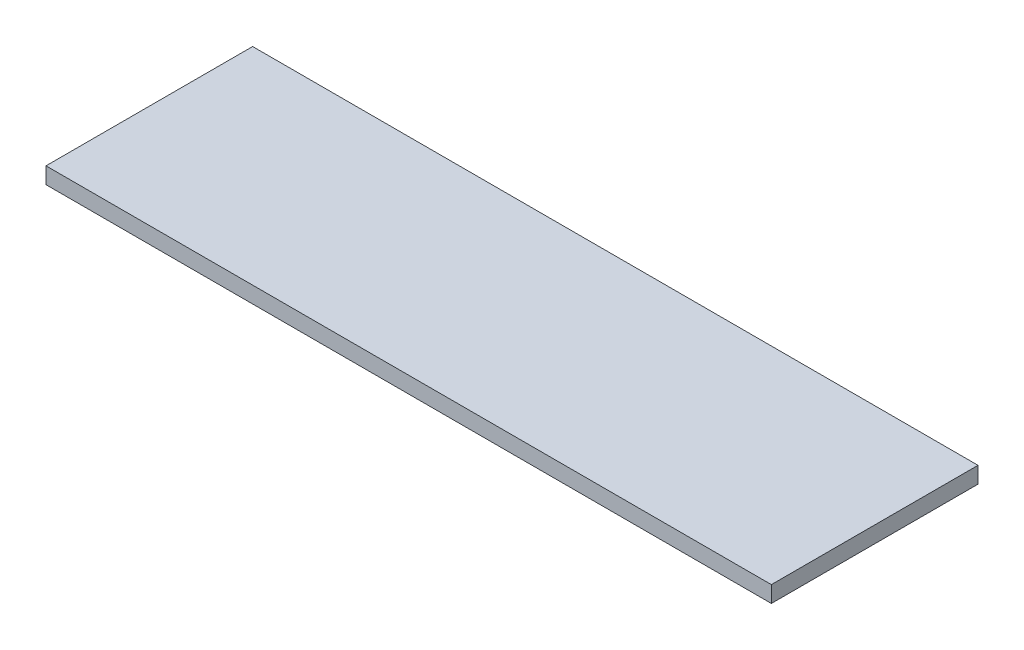
ISO-10303-21;
HEADER;
FILE_DESCRIPTION(('STEP AP214'),'2;1');
FILE_NAME('part.step','',(''),(''),'','','');
FILE_SCHEMA(('AUTOMOTIVE_DESIGN { 1 0 10303 214 1 1 1 1 }'));
ENDSEC;
DATA;
#1=APPLICATION_CONTEXT('core data for automotive mechanical design processes');
#2=APPLICATION_PROTOCOL_DEFINITION('international standard','automotive_design',2000,#1);
#3=PRODUCT_CONTEXT('',#1,'mechanical');
#4=PRODUCT('Part','Part','',(#3));
#5=PRODUCT_RELATED_PRODUCT_CATEGORY('part','',(#4));
#6=PRODUCT_DEFINITION_FORMATION('','',#4);
#7=PRODUCT_DEFINITION_CONTEXT('part definition',#1,'design');
#8=PRODUCT_DEFINITION('design','',#6,#7);
#9=PRODUCT_DEFINITION_SHAPE('','',#8);
#10=(LENGTH_UNIT() NAMED_UNIT(*) SI_UNIT(.MILLI.,.METRE.));
#11=(NAMED_UNIT(*) PLANE_ANGLE_UNIT() SI_UNIT($,.RADIAN.));
#12=(NAMED_UNIT(*) SI_UNIT($,.STERADIAN.) SOLID_ANGLE_UNIT());
#13=UNCERTAINTY_MEASURE_WITH_UNIT(LENGTH_MEASURE(1.E-05),#10,'distance_accuracy_value','');
#14=(GEOMETRIC_REPRESENTATION_CONTEXT(3) GLOBAL_UNCERTAINTY_ASSIGNED_CONTEXT((#13)) GLOBAL_UNIT_ASSIGNED_CONTEXT((#10,
#11,#12)) REPRESENTATION_CONTEXT('',''));
#15=CARTESIAN_POINT('',(0.,0.,0.));
#16=DIRECTION('',(0.,0.,1.));
#17=DIRECTION('',(1.,0.,0.));
#18=AXIS2_PLACEMENT_3D('',#15,#16,#17);
#19=CARTESIAN_POINT('',(-14.9999999999993,-17.9999999999955,-18.));
#20=DIRECTION('',(1.,0.,0.));
#21=DIRECTION('',(0.,0.,-1.));
#22=AXIS2_PLACEMENT_3D('',#19,#20,#21);
#23=PLANE('',#22);
#24=DIRECTION('',(0.,0.,1.));
#25=VECTOR('',#24,1.);
#26=CARTESIAN_POINT('',(-14.9999999999993,4.47558656802016E-12,-18.));
#27=LINE('',#26,#25);
#28=CARTESIAN_POINT('',(-14.9999999999993,4.47558656802016E-12,-18.));
#29=VERTEX_POINT('',#28);
#30=CARTESIAN_POINT('',(-14.9999999999993,4.47558656802016E-12,209.399999999997));
#31=VERTEX_POINT('',#30);
#32=EDGE_CURVE('E35',#29,#31,#27,.T.);
#33=ORIENTED_EDGE('',*,*,#32,.T.);
#34=DIRECTION('',(0.,-1.,0.));
#35=VECTOR('',#34,1.);
#36=CARTESIAN_POINT('',(-14.9999999999992,4.47651909203336E-12,209.399999999997));
#37=LINE('',#36,#35);
#38=CARTESIAN_POINT('',(-14.9999999999993,-17.9999999999955,209.399999999997));
#39=VERTEX_POINT('',#38);
#40=EDGE_CURVE('E76',#31,#39,#37,.T.);
#41=ORIENTED_EDGE('',*,*,#40,.T.);
#42=DIRECTION('',(0.,0.,1.));
#43=VECTOR('',#42,1.);
#44=CARTESIAN_POINT('',(-14.9999999999993,-17.9999999999955,-18.));
#45=LINE('',#44,#43);
#46=CARTESIAN_POINT('',(-14.9999999999993,-17.9999999999955,-18.));
#47=VERTEX_POINT('',#46);
#48=EDGE_CURVE('E11',#47,#39,#45,.T.);
#49=ORIENTED_EDGE('',*,*,#48,.F.);
#50=DIRECTION('',(0.,1.,0.));
#51=VECTOR('',#50,1.);
#52=CARTESIAN_POINT('',(-14.9999999999993,-17.9999999999955,-18.));
#53=LINE('',#52,#51);
#54=EDGE_CURVE('E90',#47,#29,#53,.T.);
#55=ORIENTED_EDGE('',*,*,#54,.T.);
#56=EDGE_LOOP('',(#33,#41,#49,#55));
#57=FACE_BOUND('',#56,.T.);
#58=ADVANCED_FACE('F32',(#57),#23,.T.);
#59=CARTESIAN_POINT('',(-14.9999999999993,-17.9999999999955,-18.));
#60=DIRECTION('',(0.,-1.,0.));
#61=DIRECTION('',(0.,0.,-1.));
#62=AXIS2_PLACEMENT_3D('',#59,#60,#61);
#63=PLANE('',#62);
#64=ORIENTED_EDGE('',*,*,#48,.T.);
#65=DIRECTION('',(-1.,0.,0.));
#66=VECTOR('',#65,1.);
#67=CARTESIAN_POINT('',(-14.9999999999993,-17.9999999999955,209.399999999997));
#68=LINE('',#67,#66);
#69=CARTESIAN_POINT('',(-813.236516537795,-17.9999999999955,209.399999999997));
#70=VERTEX_POINT('',#69);
#71=EDGE_CURVE('E72',#39,#70,#68,.T.);
#72=ORIENTED_EDGE('',*,*,#71,.T.);
#73=DIRECTION('',(0.,0.,1.));
#74=VECTOR('',#73,1.);
#75=CARTESIAN_POINT('',(-813.236516537795,-17.9999999999955,-18.));
#76=LINE('',#75,#74);
#77=CARTESIAN_POINT('',(-813.236516537795,-17.9999999999955,-18.));
#78=VERTEX_POINT('',#77);
#79=EDGE_CURVE('E40',#78,#70,#76,.T.);
#80=ORIENTED_EDGE('',*,*,#79,.F.);
#81=DIRECTION('',(1.,0.,0.));
#82=VECTOR('',#81,1.);
#83=CARTESIAN_POINT('',(-14.9999999999993,-17.9999999999955,-18.));
#84=LINE('',#83,#82);
#85=EDGE_CURVE('E74',#78,#47,#84,.T.);
#86=ORIENTED_EDGE('',*,*,#85,.T.);
#87=EDGE_LOOP('',(#64,#72,#80,#86));
#88=FACE_BOUND('',#87,.T.);
#89=ADVANCED_FACE('F70',(#88),#63,.T.);
#90=CARTESIAN_POINT('',(-813.236516537795,-17.9999999999955,-18.));
#91=DIRECTION('',(-1.,0.,0.));
#92=DIRECTION('',(0.,0.,1.));
#93=AXIS2_PLACEMENT_3D('',#90,#91,#92);
#94=PLANE('',#93);
#95=ORIENTED_EDGE('',*,*,#79,.T.);
#96=DIRECTION('',(0.,-1.,0.));
#97=VECTOR('',#96,1.);
#98=CARTESIAN_POINT('',(-813.236516537795,-17.9999999999955,209.399999999997));
#99=LINE('',#98,#97);
#100=CARTESIAN_POINT('',(-813.236516537795,4.47558656802016E-12,209.399999999997));
#101=VERTEX_POINT('',#100);
#102=EDGE_CURVE('E85',#101,#70,#99,.T.);
#103=ORIENTED_EDGE('',*,*,#102,.F.);
#104=DIRECTION('',(0.,0.,1.));
#105=VECTOR('',#104,1.);
#106=CARTESIAN_POINT('',(-813.236516537795,4.47558656802016E-12,-18.));
#107=LINE('',#106,#105);
#108=CARTESIAN_POINT('',(-813.236516537795,4.47558656802016E-12,-18.));
#109=VERTEX_POINT('',#108);
#110=EDGE_CURVE('E98',#109,#101,#107,.T.);
#111=ORIENTED_EDGE('',*,*,#110,.F.);
#112=DIRECTION('',(0.,-1.,0.));
#113=VECTOR('',#112,1.);
#114=CARTESIAN_POINT('',(-813.236516537795,-17.9999999999955,-18.));
#115=LINE('',#114,#113);
#116=EDGE_CURVE('E95',#109,#78,#115,.T.);
#117=ORIENTED_EDGE('',*,*,#116,.T.);
#118=EDGE_LOOP('',(#95,#103,#111,#117));
#119=FACE_BOUND('',#118,.T.);
#120=ADVANCED_FACE('F104',(#119),#94,.T.);
#121=CARTESIAN_POINT('',(-14.9999999999993,4.47558656802016E-12,-18.));
#122=DIRECTION('',(0.,1.,0.));
#123=DIRECTION('',(0.,0.,1.));
#124=AXIS2_PLACEMENT_3D('',#121,#122,#123);
#125=PLANE('',#124);
#126=ORIENTED_EDGE('',*,*,#110,.T.);
#127=DIRECTION('',(-1.,0.,0.));
#128=VECTOR('',#127,1.);
#129=CARTESIAN_POINT('',(-14.9999999999992,4.47651909203336E-12,209.399999999997));
#130=LINE('',#129,#128);
#131=EDGE_CURVE('E80',#31,#101,#130,.T.);
#132=ORIENTED_EDGE('',*,*,#131,.F.);
#133=ORIENTED_EDGE('',*,*,#32,.F.);
#134=DIRECTION('',(-1.,0.,0.));
#135=VECTOR('',#134,1.);
#136=CARTESIAN_POINT('',(-14.9999999999993,4.47558656802016E-12,-18.));
#137=LINE('',#136,#135);
#138=EDGE_CURVE('E92',#29,#109,#137,.T.);
#139=ORIENTED_EDGE('',*,*,#138,.T.);
#140=EDGE_LOOP('',(#126,#132,#133,#139));
#141=FACE_BOUND('',#140,.T.);
#142=ADVANCED_FACE('F100',(#141),#125,.T.);
#143=CARTESIAN_POINT('',(0.,0.,-18.));
#144=DIRECTION('',(0.,0.,1.));
#145=DIRECTION('',(1.,0.,0.));
#146=AXIS2_PLACEMENT_3D('',#143,#144,#145);
#147=PLANE('',#146);
#148=ORIENTED_EDGE('',*,*,#54,.F.);
#149=ORIENTED_EDGE('',*,*,#85,.F.);
#150=ORIENTED_EDGE('',*,*,#116,.F.);
#151=ORIENTED_EDGE('',*,*,#138,.F.);
#152=EDGE_LOOP('',(#148,#149,#150,#151));
#153=FACE_BOUND('',#152,.T.);
#154=ADVANCED_FACE('F106',(#153),#147,.F.);
#155=CARTESIAN_POINT('',(-14.9999999999992,4.47651909203336E-12,209.399999999997));
#156=DIRECTION('',(0.,0.,1.));
#157=DIRECTION('',(0.,1.,0.));
#158=AXIS2_PLACEMENT_3D('',#155,#156,#157);
#159=PLANE('',#158);
#160=ORIENTED_EDGE('',*,*,#71,.F.);
#161=ORIENTED_EDGE('',*,*,#40,.F.);
#162=ORIENTED_EDGE('',*,*,#131,.T.);
#163=ORIENTED_EDGE('',*,*,#102,.T.);
#164=EDGE_LOOP('',(#160,#161,#162,#163));
#165=FACE_BOUND('',#164,.T.);
#166=ADVANCED_FACE('F83',(#165),#159,.T.);
#167=CLOSED_SHELL('',(#58,#89,#120,#142,#154,#166));
#168=MANIFOLD_SOLID_BREP('B2',#167);
#169=ADVANCED_BREP_SHAPE_REPRESENTATION('',(#18,#168),#14);
#170=SHAPE_DEFINITION_REPRESENTATION(#9,#169);
ENDSEC;
END-ISO-10303-21;
